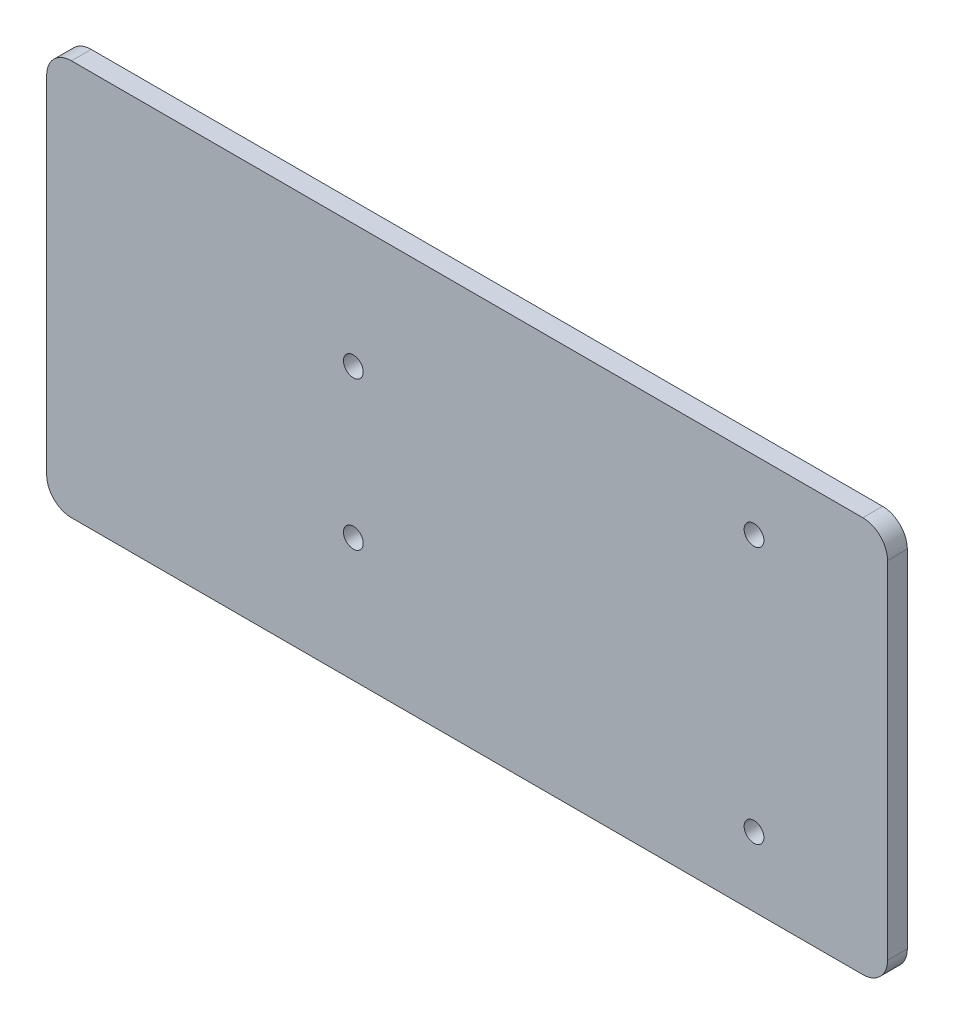
ISO-10303-21;
HEADER;
FILE_DESCRIPTION(('STEP AP214'),'2;1');
FILE_NAME('part.step','',(''),(''),'','','');
FILE_SCHEMA(('AUTOMOTIVE_DESIGN { 1 0 10303 214 1 1 1 1 }'));
ENDSEC;
DATA;
#1=APPLICATION_CONTEXT('core data for automotive mechanical design processes');
#2=APPLICATION_PROTOCOL_DEFINITION('international standard','automotive_design',2000,#1);
#3=PRODUCT_CONTEXT('',#1,'mechanical');
#4=PRODUCT('Part','Part','',(#3));
#5=PRODUCT_RELATED_PRODUCT_CATEGORY('part','',(#4));
#6=PRODUCT_DEFINITION_FORMATION('','',#4);
#7=PRODUCT_DEFINITION_CONTEXT('part definition',#1,'design');
#8=PRODUCT_DEFINITION('design','',#6,#7);
#9=PRODUCT_DEFINITION_SHAPE('','',#8);
#10=(LENGTH_UNIT() NAMED_UNIT(*) SI_UNIT(.MILLI.,.METRE.));
#11=(NAMED_UNIT(*) PLANE_ANGLE_UNIT() SI_UNIT($,.RADIAN.));
#12=(NAMED_UNIT(*) SI_UNIT($,.STERADIAN.) SOLID_ANGLE_UNIT());
#13=UNCERTAINTY_MEASURE_WITH_UNIT(LENGTH_MEASURE(1.E-05),#10,'distance_accuracy_value','');
#14=(GEOMETRIC_REPRESENTATION_CONTEXT(3) GLOBAL_UNCERTAINTY_ASSIGNED_CONTEXT((#13)) GLOBAL_UNIT_ASSIGNED_CONTEXT((#10,
#11,#12)) REPRESENTATION_CONTEXT('',''));
#15=CARTESIAN_POINT('',(0.,0.,0.));
#16=DIRECTION('',(0.,0.,1.));
#17=DIRECTION('',(1.,0.,0.));
#18=AXIS2_PLACEMENT_3D('',#15,#16,#17);
#19=CARTESIAN_POINT('',(-62.1701414432981,87.6287725566978,-35.3246563311678));
#20=DIRECTION('',(0.,0.,-1.));
#21=DIRECTION('',(-1.,0.,0.));
#22=AXIS2_PLACEMENT_3D('',#19,#20,#21);
#23=PLANE('',#22);
#24=CARTESIAN_POINT('',(-62.1701414432981,87.6287725566978,-35.3246563311678));
#25=DIRECTION('',(0.,0.,1.));
#26=DIRECTION('',(-1.,0.,0.));
#27=AXIS2_PLACEMENT_3D('',#24,#25,#26);
#28=CIRCLE('',#27,5.);
#29=CARTESIAN_POINT('',(-62.1701414432981,92.6287725566978,-35.3246563311678));
#30=VERTEX_POINT('',#29);
#31=CARTESIAN_POINT('',(-67.1701414432981,87.6287725566977,-35.3246563311678));
#32=VERTEX_POINT('',#31);
#33=EDGE_CURVE('E151',#30,#32,#28,.T.);
#34=ORIENTED_EDGE('',*,*,#33,.T.);
#35=DIRECTION('',(0.,-1.,0.));
#36=VECTOR('',#35,1.);
#37=CARTESIAN_POINT('',(-67.1701414432981,17.6287725566978,-35.3246563311678));
#38=LINE('',#37,#36);
#39=CARTESIAN_POINT('',(-67.1701414432981,17.6287725566978,-35.3246563311678));
#40=VERTEX_POINT('',#39);
#41=EDGE_CURVE('E99',#32,#40,#38,.T.);
#42=ORIENTED_EDGE('',*,*,#41,.T.);
#43=CARTESIAN_POINT('',(-62.1701414432981,17.6287725566978,-35.3246563311678));
#44=DIRECTION('',(0.,0.,1.));
#45=DIRECTION('',(1.,0.,0.));
#46=AXIS2_PLACEMENT_3D('',#43,#44,#45);
#47=CIRCLE('',#46,5.);
#48=CARTESIAN_POINT('',(-62.1701414432981,12.6287725566978,-35.3246563311678));
#49=VERTEX_POINT('',#48);
#50=EDGE_CURVE('E166',#40,#49,#47,.T.);
#51=ORIENTED_EDGE('',*,*,#50,.T.);
#52=DIRECTION('',(1.,0.,0.));
#53=VECTOR('',#52,1.);
#54=CARTESIAN_POINT('',(-62.1701414432981,12.6287725566978,-35.3246563311678));
#55=LINE('',#54,#53);
#56=CARTESIAN_POINT('',(97.8298585567019,12.6287725566978,-35.3246563311678));
#57=VERTEX_POINT('',#56);
#58=EDGE_CURVE('E179',#49,#57,#55,.T.);
#59=ORIENTED_EDGE('',*,*,#58,.T.);
#60=CARTESIAN_POINT('',(97.8298585567019,17.6287725566978,-35.3246563311678));
#61=DIRECTION('',(0.,0.,1.));
#62=DIRECTION('',(1.,0.,0.));
#63=AXIS2_PLACEMENT_3D('',#60,#61,#62);
#64=CIRCLE('',#63,5.);
#65=CARTESIAN_POINT('',(102.829858556702,17.6287725566978,-35.3246563311678));
#66=VERTEX_POINT('',#65);
#67=EDGE_CURVE('E118',#57,#66,#64,.T.);
#68=ORIENTED_EDGE('',*,*,#67,.T.);
#69=DIRECTION('',(0.,1.,0.));
#70=VECTOR('',#69,1.);
#71=CARTESIAN_POINT('',(102.829858556702,17.6287725566978,-35.3246563311678));
#72=LINE('',#71,#70);
#73=CARTESIAN_POINT('',(102.829858556702,87.6287725566977,-35.3246563311678));
#74=VERTEX_POINT('',#73);
#75=EDGE_CURVE('E112',#66,#74,#72,.T.);
#76=ORIENTED_EDGE('',*,*,#75,.T.);
#77=CARTESIAN_POINT('',(97.8298585567019,87.6287725566978,-35.3246563311678));
#78=DIRECTION('',(0.,0.,1.));
#79=DIRECTION('',(1.,0.,0.));
#80=AXIS2_PLACEMENT_3D('',#77,#78,#79);
#81=CIRCLE('',#80,5.);
#82=CARTESIAN_POINT('',(97.8298585567019,92.6287725566978,-35.3246563311678));
#83=VERTEX_POINT('',#82);
#84=EDGE_CURVE('E116',#74,#83,#81,.T.);
#85=ORIENTED_EDGE('',*,*,#84,.T.);
#86=DIRECTION('',(-1.,0.,0.));
#87=VECTOR('',#86,1.);
#88=CARTESIAN_POINT('',(-62.1701414432981,92.6287725566978,-35.3246563311678));
#89=LINE('',#88,#87);
#90=EDGE_CURVE('E56',#83,#30,#89,.T.);
#91=ORIENTED_EDGE('',*,*,#90,.T.);
#92=EDGE_LOOP('',(#34,#42,#51,#59,#68,#76,#85,#91));
#93=FACE_BOUND('',#92,.T.);
#94=CARTESIAN_POINT('',(75.8298585567019,78.6287725566978,-35.3246563311678));
#95=DIRECTION('',(0.,0.,1.));
#96=DIRECTION('',(1.,0.,0.));
#97=AXIS2_PLACEMENT_3D('',#94,#95,#96);
#98=CIRCLE('',#97,2.);
#99=CARTESIAN_POINT('',(77.8298585567019,78.6287725566978,-35.3246563311678));
#100=VERTEX_POINT('',#99);
#101=EDGE_CURVE('E140',#100,#100,#98,.T.);
#102=ORIENTED_EDGE('',*,*,#101,.F.);
#103=EDGE_LOOP('',(#102));
#104=FACE_BOUND('',#103,.T.);
#105=CARTESIAN_POINT('',(-5.1701414432981,67.6287725566978,-35.3246563311678));
#106=DIRECTION('',(0.,0.,1.));
#107=DIRECTION('',(1.,0.,0.));
#108=AXIS2_PLACEMENT_3D('',#105,#106,#107);
#109=CIRCLE('',#108,2.);
#110=CARTESIAN_POINT('',(-3.1701414432981,67.6287725566978,-35.3246563311678));
#111=VERTEX_POINT('',#110);
#112=EDGE_CURVE('E188',#111,#111,#109,.T.);
#113=ORIENTED_EDGE('',*,*,#112,.F.);
#114=EDGE_LOOP('',(#113));
#115=FACE_BOUND('',#114,.T.);
#116=CARTESIAN_POINT('',(-5.1701414432981,37.6287725566978,-35.3246563311678));
#117=DIRECTION('',(0.,0.,1.));
#118=DIRECTION('',(1.,0.,0.));
#119=AXIS2_PLACEMENT_3D('',#116,#117,#118);
#120=CIRCLE('',#119,2.);
#121=CARTESIAN_POINT('',(-3.1701414432981,37.6287725566978,-35.3246563311678));
#122=VERTEX_POINT('',#121);
#123=EDGE_CURVE('E194',#122,#122,#120,.T.);
#124=ORIENTED_EDGE('',*,*,#123,.F.);
#125=EDGE_LOOP('',(#124));
#126=FACE_BOUND('',#125,.T.);
#127=CARTESIAN_POINT('',(75.8298585567019,26.6287725566978,-35.3246563311678));
#128=DIRECTION('',(0.,0.,1.));
#129=DIRECTION('',(1.,0.,0.));
#130=AXIS2_PLACEMENT_3D('',#127,#128,#129);
#131=CIRCLE('',#130,2.);
#132=CARTESIAN_POINT('',(77.8298585567019,26.6287725566978,-35.3246563311678));
#133=VERTEX_POINT('',#132);
#134=EDGE_CURVE('E200',#133,#133,#131,.T.);
#135=ORIENTED_EDGE('',*,*,#134,.F.);
#136=EDGE_LOOP('',(#135));
#137=FACE_BOUND('',#136,.T.);
#138=ADVANCED_FACE('F39',(#93,#104,#115,#126,#137),#23,.F.);
#139=CARTESIAN_POINT('',(-62.1701414432981,87.6287725566978,-39.3246563311678));
#140=DIRECTION('',(0.,0.,-1.));
#141=DIRECTION('',(-1.,0.,0.));
#142=AXIS2_PLACEMENT_3D('',#139,#140,#141);
#143=PLANE('',#142);
#144=CARTESIAN_POINT('',(-5.1701414432981,37.6287725566978,-39.3246563311678));
#145=DIRECTION('',(0.,0.,1.));
#146=DIRECTION('',(1.,0.,0.));
#147=AXIS2_PLACEMENT_3D('',#144,#145,#146);
#148=CIRCLE('',#147,2.);
#149=CARTESIAN_POINT('',(-3.1701414432981,37.6287725566978,-39.3246563311678));
#150=VERTEX_POINT('',#149);
#151=EDGE_CURVE('E197',#150,#150,#148,.T.);
#152=ORIENTED_EDGE('',*,*,#151,.T.);
#153=EDGE_LOOP('',(#152));
#154=FACE_BOUND('',#153,.T.);
#155=CARTESIAN_POINT('',(75.8298585567019,78.6287725566978,-39.3246563311678));
#156=DIRECTION('',(0.,0.,1.));
#157=DIRECTION('',(1.,0.,0.));
#158=AXIS2_PLACEMENT_3D('',#155,#156,#157);
#159=CIRCLE('',#158,2.);
#160=CARTESIAN_POINT('',(77.8298585567019,78.6287725566978,-39.3246563311678));
#161=VERTEX_POINT('',#160);
#162=EDGE_CURVE('E185',#161,#161,#159,.T.);
#163=ORIENTED_EDGE('',*,*,#162,.T.);
#164=EDGE_LOOP('',(#163));
#165=FACE_BOUND('',#164,.T.);
#166=CARTESIAN_POINT('',(-62.1701414432981,87.6287725566978,-39.3246563311678));
#167=DIRECTION('',(0.,0.,1.));
#168=DIRECTION('',(-1.,0.,0.));
#169=AXIS2_PLACEMENT_3D('',#166,#167,#168);
#170=CIRCLE('',#169,5.);
#171=CARTESIAN_POINT('',(-62.1701414432981,92.6287725566978,-39.3246563311678));
#172=VERTEX_POINT('',#171);
#173=CARTESIAN_POINT('',(-67.1701414432981,87.6287725566977,-39.3246563311678));
#174=VERTEX_POINT('',#173);
#175=EDGE_CURVE('E136',#172,#174,#170,.T.);
#176=ORIENTED_EDGE('',*,*,#175,.F.);
#177=DIRECTION('',(-1.,0.,0.));
#178=VECTOR('',#177,1.);
#179=CARTESIAN_POINT('',(-62.1701414432981,92.6287725566978,-39.3246563311678));
#180=LINE('',#179,#178);
#181=CARTESIAN_POINT('',(97.8298585567019,92.6287725566978,-39.3246563311678));
#182=VERTEX_POINT('',#181);
#183=EDGE_CURVE('E91',#182,#172,#180,.T.);
#184=ORIENTED_EDGE('',*,*,#183,.F.);
#185=CARTESIAN_POINT('',(97.8298585567019,87.6287725566978,-39.3246563311678));
#186=DIRECTION('',(0.,0.,1.));
#187=DIRECTION('',(1.,0.,0.));
#188=AXIS2_PLACEMENT_3D('',#185,#186,#187);
#189=CIRCLE('',#188,5.);
#190=CARTESIAN_POINT('',(102.829858556702,87.6287725566977,-39.3246563311678));
#191=VERTEX_POINT('',#190);
#192=EDGE_CURVE('E85',#191,#182,#189,.T.);
#193=ORIENTED_EDGE('',*,*,#192,.F.);
#194=DIRECTION('',(0.,1.,0.));
#195=VECTOR('',#194,1.);
#196=CARTESIAN_POINT('',(102.829858556702,17.6287725566978,-39.3246563311678));
#197=LINE('',#196,#195);
#198=CARTESIAN_POINT('',(102.829858556702,17.6287725566978,-39.3246563311678));
#199=VERTEX_POINT('',#198);
#200=EDGE_CURVE('E126',#199,#191,#197,.T.);
#201=ORIENTED_EDGE('',*,*,#200,.F.);
#202=CARTESIAN_POINT('',(97.8298585567019,17.6287725566978,-39.3246563311678));
#203=DIRECTION('',(0.,0.,1.));
#204=DIRECTION('',(1.,0.,0.));
#205=AXIS2_PLACEMENT_3D('',#202,#203,#204);
#206=CIRCLE('',#205,5.);
#207=CARTESIAN_POINT('',(97.8298585567019,12.6287725566978,-39.3246563311678));
#208=VERTEX_POINT('',#207);
#209=EDGE_CURVE('E146',#208,#199,#206,.T.);
#210=ORIENTED_EDGE('',*,*,#209,.F.);
#211=DIRECTION('',(1.,0.,0.));
#212=VECTOR('',#211,1.);
#213=CARTESIAN_POINT('',(-62.1701414432981,12.6287725566978,-39.3246563311678));
#214=LINE('',#213,#212);
#215=CARTESIAN_POINT('',(-62.1701414432981,12.6287725566978,-39.3246563311678));
#216=VERTEX_POINT('',#215);
#217=EDGE_CURVE('E144',#216,#208,#214,.T.);
#218=ORIENTED_EDGE('',*,*,#217,.F.);
#219=CARTESIAN_POINT('',(-62.1701414432981,17.6287725566978,-39.3246563311678));
#220=DIRECTION('',(0.,0.,1.));
#221=DIRECTION('',(1.,0.,0.));
#222=AXIS2_PLACEMENT_3D('',#219,#220,#221);
#223=CIRCLE('',#222,5.);
#224=CARTESIAN_POINT('',(-67.1701414432981,17.6287725566978,-39.3246563311678));
#225=VERTEX_POINT('',#224);
#226=EDGE_CURVE('E142',#225,#216,#223,.T.);
#227=ORIENTED_EDGE('',*,*,#226,.F.);
#228=DIRECTION('',(0.,-1.,0.));
#229=VECTOR('',#228,1.);
#230=CARTESIAN_POINT('',(-67.1701414432981,17.6287725566978,-39.3246563311678));
#231=LINE('',#230,#229);
#232=EDGE_CURVE('E139',#174,#225,#231,.T.);
#233=ORIENTED_EDGE('',*,*,#232,.F.);
#234=EDGE_LOOP('',(#176,#184,#193,#201,#210,#218,#227,#233));
#235=FACE_BOUND('',#234,.T.);
#236=CARTESIAN_POINT('',(-5.1701414432981,67.6287725566978,-39.3246563311678));
#237=DIRECTION('',(0.,0.,1.));
#238=DIRECTION('',(1.,0.,0.));
#239=AXIS2_PLACEMENT_3D('',#236,#237,#238);
#240=CIRCLE('',#239,2.);
#241=CARTESIAN_POINT('',(-3.1701414432981,67.6287725566978,-39.3246563311678));
#242=VERTEX_POINT('',#241);
#243=EDGE_CURVE('E191',#242,#242,#240,.T.);
#244=ORIENTED_EDGE('',*,*,#243,.T.);
#245=EDGE_LOOP('',(#244));
#246=FACE_BOUND('',#245,.T.);
#247=CARTESIAN_POINT('',(75.8298585567019,26.6287725566978,-39.3246563311678));
#248=DIRECTION('',(0.,0.,1.));
#249=DIRECTION('',(1.,0.,0.));
#250=AXIS2_PLACEMENT_3D('',#247,#248,#249);
#251=CIRCLE('',#250,2.);
#252=CARTESIAN_POINT('',(77.8298585567019,26.6287725566978,-39.3246563311678));
#253=VERTEX_POINT('',#252);
#254=EDGE_CURVE('E203',#253,#253,#251,.T.);
#255=ORIENTED_EDGE('',*,*,#254,.T.);
#256=EDGE_LOOP('',(#255));
#257=FACE_BOUND('',#256,.T.);
#258=ADVANCED_FACE('F170',(#154,#165,#235,#246,#257),#143,.T.);
#259=CARTESIAN_POINT('',(-62.1701414432981,87.6287725566978,-35.3246563311678));
#260=DIRECTION('',(0.,0.,-1.));
#261=DIRECTION('',(-1.,0.,0.));
#262=AXIS2_PLACEMENT_3D('',#259,#260,#261);
#263=CYLINDRICAL_SURFACE('',#262,5.);
#264=ORIENTED_EDGE('',*,*,#175,.T.);
#265=DIRECTION('',(0.,0.,-1.));
#266=VECTOR('',#265,1.);
#267=CARTESIAN_POINT('',(-67.1701414432981,87.6287725566977,-35.3246563311678));
#268=LINE('',#267,#266);
#269=EDGE_CURVE('E11',#32,#174,#268,.T.);
#270=ORIENTED_EDGE('',*,*,#269,.F.);
#271=ORIENTED_EDGE('',*,*,#33,.F.);
#272=DIRECTION('',(0.,0.,-1.));
#273=VECTOR('',#272,1.);
#274=CARTESIAN_POINT('',(-62.1701414432981,92.6287725566978,-35.3246563311678));
#275=LINE('',#274,#273);
#276=EDGE_CURVE('E132',#30,#172,#275,.T.);
#277=ORIENTED_EDGE('',*,*,#276,.T.);
#278=EDGE_LOOP('',(#264,#270,#271,#277));
#279=FACE_BOUND('',#278,.T.);
#280=ADVANCED_FACE('F41',(#279),#263,.T.);
#281=CARTESIAN_POINT('',(-67.1701414432981,17.6287725566978,-35.3246563311678));
#282=DIRECTION('',(1.,0.,0.));
#283=DIRECTION('',(0.,0.,-1.));
#284=AXIS2_PLACEMENT_3D('',#281,#282,#283);
#285=PLANE('',#284);
#286=ORIENTED_EDGE('',*,*,#232,.T.);
#287=DIRECTION('',(0.,0.,-1.));
#288=VECTOR('',#287,1.);
#289=CARTESIAN_POINT('',(-67.1701414432981,17.6287725566978,-35.3246563311678));
#290=LINE('',#289,#288);
#291=EDGE_CURVE('E48',#40,#225,#290,.T.);
#292=ORIENTED_EDGE('',*,*,#291,.F.);
#293=ORIENTED_EDGE('',*,*,#41,.F.);
#294=ORIENTED_EDGE('',*,*,#269,.T.);
#295=EDGE_LOOP('',(#286,#292,#293,#294));
#296=FACE_BOUND('',#295,.T.);
#297=ADVANCED_FACE('F235',(#296),#285,.F.);
#298=CARTESIAN_POINT('',(-62.1701414432981,17.6287725566978,-35.3246563311678));
#299=DIRECTION('',(0.,0.,-1.));
#300=DIRECTION('',(-1.,0.,0.));
#301=AXIS2_PLACEMENT_3D('',#298,#299,#300);
#302=CYLINDRICAL_SURFACE('',#301,5.);
#303=ORIENTED_EDGE('',*,*,#226,.T.);
#304=DIRECTION('',(0.,0.,-1.));
#305=VECTOR('',#304,1.);
#306=CARTESIAN_POINT('',(-62.1701414432981,12.6287725566978,-35.3246563311678));
#307=LINE('',#306,#305);
#308=EDGE_CURVE('E158',#49,#216,#307,.T.);
#309=ORIENTED_EDGE('',*,*,#308,.F.);
#310=ORIENTED_EDGE('',*,*,#50,.F.);
#311=ORIENTED_EDGE('',*,*,#291,.T.);
#312=EDGE_LOOP('',(#303,#309,#310,#311));
#313=FACE_BOUND('',#312,.T.);
#314=ADVANCED_FACE('F164',(#313),#302,.T.);
#315=CARTESIAN_POINT('',(-62.1701414432981,12.6287725566978,-35.3246563311678));
#316=DIRECTION('',(0.,1.,0.));
#317=DIRECTION('',(0.,0.,1.));
#318=AXIS2_PLACEMENT_3D('',#315,#316,#317);
#319=PLANE('',#318);
#320=ORIENTED_EDGE('',*,*,#217,.T.);
#321=DIRECTION('',(0.,0.,-1.));
#322=VECTOR('',#321,1.);
#323=CARTESIAN_POINT('',(97.8298585567019,12.6287725566978,-35.3246563311678));
#324=LINE('',#323,#322);
#325=EDGE_CURVE('E155',#57,#208,#324,.T.);
#326=ORIENTED_EDGE('',*,*,#325,.F.);
#327=ORIENTED_EDGE('',*,*,#58,.F.);
#328=ORIENTED_EDGE('',*,*,#308,.T.);
#329=EDGE_LOOP('',(#320,#326,#327,#328));
#330=FACE_BOUND('',#329,.T.);
#331=ADVANCED_FACE('F175',(#330),#319,.F.);
#332=CARTESIAN_POINT('',(97.8298585567019,17.6287725566978,-35.3246563311678));
#333=DIRECTION('',(0.,0.,-1.));
#334=DIRECTION('',(-1.,0.,0.));
#335=AXIS2_PLACEMENT_3D('',#332,#333,#334);
#336=CYLINDRICAL_SURFACE('',#335,5.);
#337=ORIENTED_EDGE('',*,*,#209,.T.);
#338=DIRECTION('',(0.,0.,-1.));
#339=VECTOR('',#338,1.);
#340=CARTESIAN_POINT('',(102.829858556702,17.6287725566978,-35.3246563311678));
#341=LINE('',#340,#339);
#342=EDGE_CURVE('E127',#66,#199,#341,.T.);
#343=ORIENTED_EDGE('',*,*,#342,.F.);
#344=ORIENTED_EDGE('',*,*,#67,.F.);
#345=ORIENTED_EDGE('',*,*,#325,.T.);
#346=EDGE_LOOP('',(#337,#343,#344,#345));
#347=FACE_BOUND('',#346,.T.);
#348=ADVANCED_FACE('F178',(#347),#336,.T.);
#349=CARTESIAN_POINT('',(102.829858556702,17.6287725566978,-35.3246563311678));
#350=DIRECTION('',(-1.,0.,0.));
#351=DIRECTION('',(0.,-1.,0.));
#352=AXIS2_PLACEMENT_3D('',#349,#350,#351);
#353=PLANE('',#352);
#354=ORIENTED_EDGE('',*,*,#200,.T.);
#355=DIRECTION('',(0.,0.,-1.));
#356=VECTOR('',#355,1.);
#357=CARTESIAN_POINT('',(102.829858556702,87.6287725566977,-35.3246563311678));
#358=LINE('',#357,#356);
#359=EDGE_CURVE('E123',#74,#191,#358,.T.);
#360=ORIENTED_EDGE('',*,*,#359,.F.);
#361=ORIENTED_EDGE('',*,*,#75,.F.);
#362=ORIENTED_EDGE('',*,*,#342,.T.);
#363=EDGE_LOOP('',(#354,#360,#361,#362));
#364=FACE_BOUND('',#363,.T.);
#365=ADVANCED_FACE('F124',(#364),#353,.F.);
#366=CARTESIAN_POINT('',(97.8298585567019,87.6287725566978,-35.3246563311678));
#367=DIRECTION('',(0.,0.,-1.));
#368=DIRECTION('',(-1.,0.,0.));
#369=AXIS2_PLACEMENT_3D('',#366,#367,#368);
#370=CYLINDRICAL_SURFACE('',#369,5.);
#371=ORIENTED_EDGE('',*,*,#192,.T.);
#372=DIRECTION('',(0.,0.,-1.));
#373=VECTOR('',#372,1.);
#374=CARTESIAN_POINT('',(97.8298585567019,92.6287725566978,-35.3246563311678));
#375=LINE('',#374,#373);
#376=EDGE_CURVE('E128',#83,#182,#375,.T.);
#377=ORIENTED_EDGE('',*,*,#376,.F.);
#378=ORIENTED_EDGE('',*,*,#84,.F.);
#379=ORIENTED_EDGE('',*,*,#359,.T.);
#380=EDGE_LOOP('',(#371,#377,#378,#379));
#381=FACE_BOUND('',#380,.T.);
#382=ADVANCED_FACE('F130',(#381),#370,.T.);
#383=CARTESIAN_POINT('',(-62.1701414432981,92.6287725566978,-35.3246563311678));
#384=DIRECTION('',(0.,-1.,0.));
#385=DIRECTION('',(0.,0.,-1.));
#386=AXIS2_PLACEMENT_3D('',#383,#384,#385);
#387=PLANE('',#386);
#388=ORIENTED_EDGE('',*,*,#183,.T.);
#389=ORIENTED_EDGE('',*,*,#276,.F.);
#390=ORIENTED_EDGE('',*,*,#90,.F.);
#391=ORIENTED_EDGE('',*,*,#376,.T.);
#392=EDGE_LOOP('',(#388,#389,#390,#391));
#393=FACE_BOUND('',#392,.T.);
#394=ADVANCED_FACE('F223',(#393),#387,.F.);
#395=CARTESIAN_POINT('',(75.8298585567019,78.6287725566978,-35.3246563311678));
#396=DIRECTION('',(0.,0.,-1.));
#397=DIRECTION('',(-1.,0.,0.));
#398=AXIS2_PLACEMENT_3D('',#395,#396,#397);
#399=CYLINDRICAL_SURFACE('',#398,2.);
#400=ORIENTED_EDGE('',*,*,#101,.T.);
#401=EDGE_LOOP('',(#400));
#402=FACE_BOUND('',#401,.T.);
#403=ORIENTED_EDGE('',*,*,#162,.F.);
#404=EDGE_LOOP('',(#403));
#405=FACE_BOUND('',#404,.T.);
#406=ADVANCED_FACE('F220',(#402,#405),#399,.F.);
#407=CARTESIAN_POINT('',(-5.1701414432981,67.6287725566978,-35.3246563311678));
#408=DIRECTION('',(0.,0.,-1.));
#409=DIRECTION('',(-1.,0.,0.));
#410=AXIS2_PLACEMENT_3D('',#407,#408,#409);
#411=CYLINDRICAL_SURFACE('',#410,2.);
#412=ORIENTED_EDGE('',*,*,#112,.T.);
#413=EDGE_LOOP('',(#412));
#414=FACE_BOUND('',#413,.T.);
#415=ORIENTED_EDGE('',*,*,#243,.F.);
#416=EDGE_LOOP('',(#415));
#417=FACE_BOUND('',#416,.T.);
#418=ADVANCED_FACE('F299',(#414,#417),#411,.F.);
#419=CARTESIAN_POINT('',(-5.1701414432981,37.6287725566978,-35.3246563311678));
#420=DIRECTION('',(0.,0.,-1.));
#421=DIRECTION('',(-1.,0.,0.));
#422=AXIS2_PLACEMENT_3D('',#419,#420,#421);
#423=CYLINDRICAL_SURFACE('',#422,2.);
#424=ORIENTED_EDGE('',*,*,#123,.T.);
#425=EDGE_LOOP('',(#424));
#426=FACE_BOUND('',#425,.T.);
#427=ORIENTED_EDGE('',*,*,#151,.F.);
#428=EDGE_LOOP('',(#427));
#429=FACE_BOUND('',#428,.T.);
#430=ADVANCED_FACE('F307',(#426,#429),#423,.F.);
#431=CARTESIAN_POINT('',(75.8298585567019,26.6287725566978,-35.3246563311678));
#432=DIRECTION('',(0.,0.,-1.));
#433=DIRECTION('',(-1.,0.,0.));
#434=AXIS2_PLACEMENT_3D('',#431,#432,#433);
#435=CYLINDRICAL_SURFACE('',#434,2.);
#436=ORIENTED_EDGE('',*,*,#134,.T.);
#437=EDGE_LOOP('',(#436));
#438=FACE_BOUND('',#437,.T.);
#439=ORIENTED_EDGE('',*,*,#254,.F.);
#440=EDGE_LOOP('',(#439));
#441=FACE_BOUND('',#440,.T.);
#442=ADVANCED_FACE('F209',(#438,#441),#435,.F.);
#443=CLOSED_SHELL('',(#138,#258,#280,#297,#314,#331,#348,#365,#382,#394,#406,#418,#430,#442));
#444=MANIFOLD_SOLID_BREP('B2',#443);
#445=ADVANCED_BREP_SHAPE_REPRESENTATION('',(#18,#444),#14);
#446=SHAPE_DEFINITION_REPRESENTATION(#9,#445);
ENDSEC;
END-ISO-10303-21;
